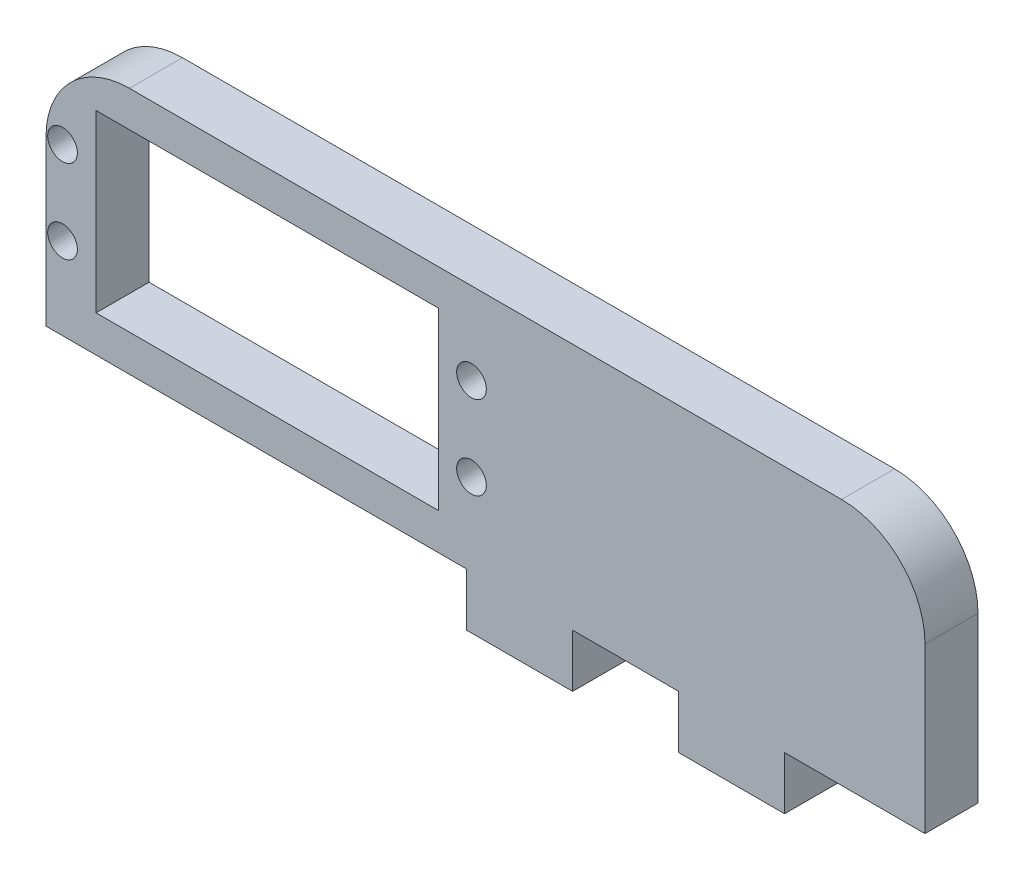
ISO-10303-21;
HEADER;
FILE_DESCRIPTION(('STEP AP214'),'2;1');
FILE_NAME('part.step','',(''),(''),'','','');
FILE_SCHEMA(('AUTOMOTIVE_DESIGN { 1 0 10303 214 1 1 1 1 }'));
ENDSEC;
DATA;
#1=APPLICATION_CONTEXT('core data for automotive mechanical design processes');
#2=APPLICATION_PROTOCOL_DEFINITION('international standard','automotive_design',2000,#1);
#3=PRODUCT_CONTEXT('',#1,'mechanical');
#4=PRODUCT('Part','Part','',(#3));
#5=PRODUCT_RELATED_PRODUCT_CATEGORY('part','',(#4));
#6=PRODUCT_DEFINITION_FORMATION('','',#4);
#7=PRODUCT_DEFINITION_CONTEXT('part definition',#1,'design');
#8=PRODUCT_DEFINITION('design','',#6,#7);
#9=PRODUCT_DEFINITION_SHAPE('','',#8);
#10=(LENGTH_UNIT() NAMED_UNIT(*) SI_UNIT(.MILLI.,.METRE.));
#11=(NAMED_UNIT(*) PLANE_ANGLE_UNIT() SI_UNIT($,.RADIAN.));
#12=(NAMED_UNIT(*) SI_UNIT($,.STERADIAN.) SOLID_ANGLE_UNIT());
#13=UNCERTAINTY_MEASURE_WITH_UNIT(LENGTH_MEASURE(1.E-05),#10,'distance_accuracy_value','');
#14=(GEOMETRIC_REPRESENTATION_CONTEXT(3) GLOBAL_UNCERTAINTY_ASSIGNED_CONTEXT((#13)) GLOBAL_UNIT_ASSIGNED_CONTEXT((#10,
#11,#12)) REPRESENTATION_CONTEXT('',''));
#15=CARTESIAN_POINT('',(0.,0.,0.));
#16=DIRECTION('',(0.,0.,1.));
#17=DIRECTION('',(1.,0.,0.));
#18=AXIS2_PLACEMENT_3D('',#15,#16,#17);
#19=CARTESIAN_POINT('',(19.05,38.1,6.35));
#20=DIRECTION('',(0.,1.,0.));
#21=DIRECTION('',(0.,0.,1.));
#22=AXIS2_PLACEMENT_3D('',#19,#20,#21);
#23=PLANE('',#22);
#24=DIRECTION('',(1.,0.,0.));
#25=VECTOR('',#24,1.);
#26=CARTESIAN_POINT('',(19.05,38.1,0.));
#27=LINE('',#26,#25);
#28=CARTESIAN_POINT('',(6.35,38.1,0.));
#29=VERTEX_POINT('',#28);
#30=CARTESIAN_POINT('',(19.05,38.1,0.));
#31=VERTEX_POINT('',#30);
#32=EDGE_CURVE('E204',#29,#31,#27,.T.);
#33=ORIENTED_EDGE('',*,*,#32,.T.);
#34=DIRECTION('',(0.,0.,-1.));
#35=VECTOR('',#34,1.);
#36=CARTESIAN_POINT('',(19.05,38.1,6.35));
#37=LINE('',#36,#35);
#38=CARTESIAN_POINT('',(19.05,38.1,6.35));
#39=VERTEX_POINT('',#38);
#40=EDGE_CURVE('E284',#39,#31,#37,.T.);
#41=ORIENTED_EDGE('',*,*,#40,.F.);
#42=DIRECTION('',(1.,0.,0.));
#43=VECTOR('',#42,1.);
#44=CARTESIAN_POINT('',(19.05,38.1,6.35));
#45=LINE('',#44,#43);
#46=CARTESIAN_POINT('',(6.35,38.1,6.35));
#47=VERTEX_POINT('',#46);
#48=EDGE_CURVE('E208',#47,#39,#45,.T.);
#49=ORIENTED_EDGE('',*,*,#48,.F.);
#50=DIRECTION('',(0.,0.,-1.));
#51=VECTOR('',#50,1.);
#52=CARTESIAN_POINT('',(6.35,38.1,6.35));
#53=LINE('',#52,#51);
#54=EDGE_CURVE('E234',#47,#29,#53,.T.);
#55=ORIENTED_EDGE('',*,*,#54,.T.);
#56=EDGE_LOOP('',(#33,#41,#49,#55));
#57=FACE_BOUND('',#56,.T.);
#58=ADVANCED_FACE('F33',(#57),#23,.F.);
#59=CARTESIAN_POINT('',(19.05,38.1,6.35));
#60=DIRECTION('',(-1.,0.,0.));
#61=DIRECTION('',(0.,0.,1.));
#62=AXIS2_PLACEMENT_3D('',#59,#60,#61);
#63=PLANE('',#62);
#64=DIRECTION('',(0.,1.,0.));
#65=VECTOR('',#64,1.);
#66=CARTESIAN_POINT('',(19.05,38.1,0.));
#67=LINE('',#66,#65);
#68=CARTESIAN_POINT('',(19.05,44.45,0.));
#69=VERTEX_POINT('',#68);
#70=EDGE_CURVE('E237',#31,#69,#67,.T.);
#71=ORIENTED_EDGE('',*,*,#70,.T.);
#72=DIRECTION('',(0.,0.,-1.));
#73=VECTOR('',#72,1.);
#74=CARTESIAN_POINT('',(19.05,44.45,6.35));
#75=LINE('',#74,#73);
#76=CARTESIAN_POINT('',(19.05,44.45,6.35));
#77=VERTEX_POINT('',#76);
#78=EDGE_CURVE('E281',#77,#69,#75,.T.);
#79=ORIENTED_EDGE('',*,*,#78,.F.);
#80=DIRECTION('',(0.,1.,0.));
#81=VECTOR('',#80,1.);
#82=CARTESIAN_POINT('',(19.05,38.1,6.35));
#83=LINE('',#82,#81);
#84=EDGE_CURVE('E211',#39,#77,#83,.T.);
#85=ORIENTED_EDGE('',*,*,#84,.F.);
#86=ORIENTED_EDGE('',*,*,#40,.T.);
#87=EDGE_LOOP('',(#71,#79,#85,#86));
#88=FACE_BOUND('',#87,.T.);
#89=ADVANCED_FACE('F329',(#88),#63,.F.);
#90=CARTESIAN_POINT('',(19.05,44.45,6.35));
#91=DIRECTION('',(0.,1.,0.));
#92=DIRECTION('',(0.,0.,1.));
#93=AXIS2_PLACEMENT_3D('',#90,#91,#92);
#94=PLANE('',#93);
#95=DIRECTION('',(1.,0.,0.));
#96=VECTOR('',#95,1.);
#97=CARTESIAN_POINT('',(19.05,44.45,0.));
#98=LINE('',#97,#96);
#99=CARTESIAN_POINT('',(35.8723967170345,44.45,0.));
#100=VERTEX_POINT('',#99);
#101=EDGE_CURVE('E239',#69,#100,#98,.T.);
#102=ORIENTED_EDGE('',*,*,#101,.T.);
#103=DIRECTION('',(0.,0.,-1.));
#104=VECTOR('',#103,1.);
#105=CARTESIAN_POINT('',(35.8723967170345,44.45,6.35));
#106=LINE('',#105,#104);
#107=CARTESIAN_POINT('',(35.8723967170345,44.45,6.35));
#108=VERTEX_POINT('',#107);
#109=EDGE_CURVE('E278',#108,#100,#106,.T.);
#110=ORIENTED_EDGE('',*,*,#109,.F.);
#111=DIRECTION('',(1.,0.,0.));
#112=VECTOR('',#111,1.);
#113=CARTESIAN_POINT('',(19.05,44.45,6.35));
#114=LINE('',#113,#112);
#115=EDGE_CURVE('E214',#77,#108,#114,.T.);
#116=ORIENTED_EDGE('',*,*,#115,.F.);
#117=ORIENTED_EDGE('',*,*,#78,.T.);
#118=EDGE_LOOP('',(#102,#110,#116,#117));
#119=FACE_BOUND('',#118,.T.);
#120=ADVANCED_FACE('F323',(#119),#94,.F.);
#121=CARTESIAN_POINT('',(35.8723967170345,44.45,6.35));
#122=DIRECTION('',(-1.,0.,0.));
#123=DIRECTION('',(0.,0.,1.));
#124=AXIS2_PLACEMENT_3D('',#121,#122,#123);
#125=PLANE('',#124);
#126=DIRECTION('',(0.,1.,0.));
#127=VECTOR('',#126,1.);
#128=CARTESIAN_POINT('',(35.8723967170345,44.45,0.));
#129=LINE('',#128,#127);
#130=CARTESIAN_POINT('',(35.8723967170345,64.1298835764106,0.));
#131=VERTEX_POINT('',#130);
#132=EDGE_CURVE('E241',#100,#131,#129,.T.);
#133=ORIENTED_EDGE('',*,*,#132,.T.);
#134=DIRECTION('',(0.,0.,-1.));
#135=VECTOR('',#134,1.);
#136=CARTESIAN_POINT('',(35.8723967170345,64.1298835764106,6.35));
#137=LINE('',#136,#135);
#138=CARTESIAN_POINT('',(35.8723967170345,64.1298835764106,6.35));
#139=VERTEX_POINT('',#138);
#140=EDGE_CURVE('E11',#131,#139,#137,.F.);
#141=ORIENTED_EDGE('',*,*,#140,.T.);
#142=DIRECTION('',(0.,1.,0.));
#143=VECTOR('',#142,1.);
#144=CARTESIAN_POINT('',(35.8723967170345,44.45,6.35));
#145=LINE('',#144,#143);
#146=EDGE_CURVE('E216',#108,#139,#145,.T.);
#147=ORIENTED_EDGE('',*,*,#146,.F.);
#148=ORIENTED_EDGE('',*,*,#109,.T.);
#149=EDGE_LOOP('',(#133,#141,#147,#148));
#150=FACE_BOUND('',#149,.T.);
#151=ADVANCED_FACE('F319',(#150),#125,.F.);
#152=CARTESIAN_POINT('',(-69.45,74.1298835764105,6.35));
#153=DIRECTION('',(0.,-1.,0.));
#154=DIRECTION('',(0.,0.,-1.));
#155=AXIS2_PLACEMENT_3D('',#152,#153,#154);
#156=PLANE('',#155);
#157=DIRECTION('',(-1.,0.,0.));
#158=VECTOR('',#157,1.);
#159=CARTESIAN_POINT('',(-69.45,74.1298835764105,0.));
#160=LINE('',#159,#158);
#161=CARTESIAN_POINT('',(25.8723967170345,74.1298835764105,0.));
#162=VERTEX_POINT('',#161);
#163=CARTESIAN_POINT('',(-59.45,74.1298835764105,0.));
#164=VERTEX_POINT('',#163);
#165=EDGE_CURVE('E243',#162,#164,#160,.T.);
#166=ORIENTED_EDGE('',*,*,#165,.T.);
#167=DIRECTION('',(0.,0.,-1.));
#168=VECTOR('',#167,1.);
#169=CARTESIAN_POINT('',(-59.45,74.1298835764105,6.35));
#170=LINE('',#169,#168);
#171=CARTESIAN_POINT('',(-59.45,74.1298835764105,6.35));
#172=VERTEX_POINT('',#171);
#173=EDGE_CURVE('E54',#164,#172,#170,.F.);
#174=ORIENTED_EDGE('',*,*,#173,.T.);
#175=DIRECTION('',(-1.,0.,0.));
#176=VECTOR('',#175,1.);
#177=CARTESIAN_POINT('',(35.8723967170345,74.1298835764105,6.35));
#178=LINE('',#177,#176);
#179=CARTESIAN_POINT('',(25.8723967170345,74.1298835764105,6.35));
#180=VERTEX_POINT('',#179);
#181=EDGE_CURVE('E218',#180,#172,#178,.T.);
#182=ORIENTED_EDGE('',*,*,#181,.F.);
#183=DIRECTION('',(0.,0.,-1.));
#184=VECTOR('',#183,1.);
#185=CARTESIAN_POINT('',(25.8723967170345,74.1298835764105,6.35));
#186=LINE('',#185,#184);
#187=EDGE_CURVE('E294',#180,#162,#186,.T.);
#188=ORIENTED_EDGE('',*,*,#187,.T.);
#189=EDGE_LOOP('',(#166,#174,#182,#188));
#190=FACE_BOUND('',#189,.T.);
#191=ADVANCED_FACE('F313',(#190),#156,.F.);
#192=CARTESIAN_POINT('',(-69.45,44.45,6.35));
#193=DIRECTION('',(1.,0.,0.));
#194=DIRECTION('',(0.,0.,-1.));
#195=AXIS2_PLACEMENT_3D('',#192,#193,#194);
#196=PLANE('',#195);
#197=DIRECTION('',(0.,-1.,0.));
#198=VECTOR('',#197,1.);
#199=CARTESIAN_POINT('',(-69.45,44.45,6.35));
#200=LINE('',#199,#198);
#201=CARTESIAN_POINT('',(-69.45,64.1298835764106,6.35));
#202=VERTEX_POINT('',#201);
#203=CARTESIAN_POINT('',(-69.45,44.45,6.35));
#204=VERTEX_POINT('',#203);
#205=EDGE_CURVE('E220',#202,#204,#200,.T.);
#206=ORIENTED_EDGE('',*,*,#205,.F.);
#207=DIRECTION('',(0.,0.,-1.));
#208=VECTOR('',#207,1.);
#209=CARTESIAN_POINT('',(-69.45,64.1298835764106,6.35));
#210=LINE('',#209,#208);
#211=CARTESIAN_POINT('',(-69.45,64.1298835764106,0.));
#212=VERTEX_POINT('',#211);
#213=EDGE_CURVE('E287',#202,#212,#210,.T.);
#214=ORIENTED_EDGE('',*,*,#213,.T.);
#215=DIRECTION('',(0.,-1.,0.));
#216=VECTOR('',#215,1.);
#217=CARTESIAN_POINT('',(-69.45,44.45,0.));
#218=LINE('',#217,#216);
#219=CARTESIAN_POINT('',(-69.45,44.45,0.));
#220=VERTEX_POINT('',#219);
#221=EDGE_CURVE('E245',#212,#220,#218,.T.);
#222=ORIENTED_EDGE('',*,*,#221,.T.);
#223=DIRECTION('',(0.,0.,-1.));
#224=VECTOR('',#223,1.);
#225=CARTESIAN_POINT('',(-69.45,44.45,6.35));
#226=LINE('',#225,#224);
#227=EDGE_CURVE('E275',#204,#220,#226,.T.);
#228=ORIENTED_EDGE('',*,*,#227,.F.);
#229=EDGE_LOOP('',(#206,#214,#222,#228));
#230=FACE_BOUND('',#229,.T.);
#231=ADVANCED_FACE('F307',(#230),#196,.F.);
#232=CARTESIAN_POINT('',(-19.05,44.45,6.35));
#233=DIRECTION('',(0.,1.,0.));
#234=DIRECTION('',(0.,0.,1.));
#235=AXIS2_PLACEMENT_3D('',#232,#233,#234);
#236=PLANE('',#235);
#237=DIRECTION('',(1.,0.,0.));
#238=VECTOR('',#237,1.);
#239=CARTESIAN_POINT('',(-19.05,44.45,0.));
#240=LINE('',#239,#238);
#241=CARTESIAN_POINT('',(-19.05,44.45,0.));
#242=VERTEX_POINT('',#241);
#243=EDGE_CURVE('E247',#220,#242,#240,.T.);
#244=ORIENTED_EDGE('',*,*,#243,.T.);
#245=DIRECTION('',(0.,0.,-1.));
#246=VECTOR('',#245,1.);
#247=CARTESIAN_POINT('',(-19.05,44.45,6.35));
#248=LINE('',#247,#246);
#249=CARTESIAN_POINT('',(-19.05,44.45,6.35));
#250=VERTEX_POINT('',#249);
#251=EDGE_CURVE('E272',#250,#242,#248,.T.);
#252=ORIENTED_EDGE('',*,*,#251,.F.);
#253=DIRECTION('',(1.,0.,0.));
#254=VECTOR('',#253,1.);
#255=CARTESIAN_POINT('',(-44.45,44.45,6.35));
#256=LINE('',#255,#254);
#257=EDGE_CURVE('E222',#204,#250,#256,.T.);
#258=ORIENTED_EDGE('',*,*,#257,.F.);
#259=ORIENTED_EDGE('',*,*,#227,.T.);
#260=EDGE_LOOP('',(#244,#252,#258,#259));
#261=FACE_BOUND('',#260,.T.);
#262=ADVANCED_FACE('F358',(#261),#236,.F.);
#263=CARTESIAN_POINT('',(-19.05,38.1,6.35));
#264=DIRECTION('',(1.,0.,0.));
#265=DIRECTION('',(0.,0.,-1.));
#266=AXIS2_PLACEMENT_3D('',#263,#264,#265);
#267=PLANE('',#266);
#268=DIRECTION('',(0.,-1.,0.));
#269=VECTOR('',#268,1.);
#270=CARTESIAN_POINT('',(-19.05,38.1,0.));
#271=LINE('',#270,#269);
#272=CARTESIAN_POINT('',(-19.05,38.1,0.));
#273=VERTEX_POINT('',#272);
#274=EDGE_CURVE('E249',#242,#273,#271,.T.);
#275=ORIENTED_EDGE('',*,*,#274,.T.);
#276=DIRECTION('',(0.,0.,-1.));
#277=VECTOR('',#276,1.);
#278=CARTESIAN_POINT('',(-19.05,38.1,6.35));
#279=LINE('',#278,#277);
#280=CARTESIAN_POINT('',(-19.05,38.1,6.35));
#281=VERTEX_POINT('',#280);
#282=EDGE_CURVE('E269',#281,#273,#279,.T.);
#283=ORIENTED_EDGE('',*,*,#282,.F.);
#284=DIRECTION('',(0.,-1.,0.));
#285=VECTOR('',#284,1.);
#286=CARTESIAN_POINT('',(-19.05,38.1,6.35));
#287=LINE('',#286,#285);
#288=EDGE_CURVE('E224',#250,#281,#287,.T.);
#289=ORIENTED_EDGE('',*,*,#288,.F.);
#290=ORIENTED_EDGE('',*,*,#251,.T.);
#291=EDGE_LOOP('',(#275,#283,#289,#290));
#292=FACE_BOUND('',#291,.T.);
#293=ADVANCED_FACE('F354',(#292),#267,.F.);
#294=CARTESIAN_POINT('',(-6.35,38.1,6.35));
#295=DIRECTION('',(0.,1.,0.));
#296=DIRECTION('',(0.,0.,1.));
#297=AXIS2_PLACEMENT_3D('',#294,#295,#296);
#298=PLANE('',#297);
#299=DIRECTION('',(1.,0.,0.));
#300=VECTOR('',#299,1.);
#301=CARTESIAN_POINT('',(-6.35,38.1,0.));
#302=LINE('',#301,#300);
#303=CARTESIAN_POINT('',(-6.35,38.1,0.));
#304=VERTEX_POINT('',#303);
#305=EDGE_CURVE('E251',#273,#304,#302,.T.);
#306=ORIENTED_EDGE('',*,*,#305,.T.);
#307=DIRECTION('',(0.,0.,-1.));
#308=VECTOR('',#307,1.);
#309=CARTESIAN_POINT('',(-6.35,38.1,6.35));
#310=LINE('',#309,#308);
#311=CARTESIAN_POINT('',(-6.35,38.1,6.35));
#312=VERTEX_POINT('',#311);
#313=EDGE_CURVE('E266',#312,#304,#310,.T.);
#314=ORIENTED_EDGE('',*,*,#313,.F.);
#315=DIRECTION('',(1.,0.,0.));
#316=VECTOR('',#315,1.);
#317=CARTESIAN_POINT('',(-6.35,38.1,6.35));
#318=LINE('',#317,#316);
#319=EDGE_CURVE('E226',#281,#312,#318,.T.);
#320=ORIENTED_EDGE('',*,*,#319,.F.);
#321=ORIENTED_EDGE('',*,*,#282,.T.);
#322=EDGE_LOOP('',(#306,#314,#320,#321));
#323=FACE_BOUND('',#322,.T.);
#324=ADVANCED_FACE('F350',(#323),#298,.F.);
#325=CARTESIAN_POINT('',(-6.35,44.45,6.35));
#326=DIRECTION('',(-1.,0.,0.));
#327=DIRECTION('',(0.,0.,1.));
#328=AXIS2_PLACEMENT_3D('',#325,#326,#327);
#329=PLANE('',#328);
#330=DIRECTION('',(0.,1.,0.));
#331=VECTOR('',#330,1.);
#332=CARTESIAN_POINT('',(-6.35,44.45,0.));
#333=LINE('',#332,#331);
#334=CARTESIAN_POINT('',(-6.35,44.45,0.));
#335=VERTEX_POINT('',#334);
#336=EDGE_CURVE('E253',#304,#335,#333,.T.);
#337=ORIENTED_EDGE('',*,*,#336,.T.);
#338=DIRECTION('',(0.,0.,-1.));
#339=VECTOR('',#338,1.);
#340=CARTESIAN_POINT('',(-6.35,44.45,6.35));
#341=LINE('',#340,#339);
#342=CARTESIAN_POINT('',(-6.35,44.45,6.35));
#343=VERTEX_POINT('',#342);
#344=EDGE_CURVE('E263',#343,#335,#341,.T.);
#345=ORIENTED_EDGE('',*,*,#344,.F.);
#346=DIRECTION('',(0.,1.,0.));
#347=VECTOR('',#346,1.);
#348=CARTESIAN_POINT('',(-6.35,44.45,6.35));
#349=LINE('',#348,#347);
#350=EDGE_CURVE('E228',#312,#343,#349,.T.);
#351=ORIENTED_EDGE('',*,*,#350,.F.);
#352=ORIENTED_EDGE('',*,*,#313,.T.);
#353=EDGE_LOOP('',(#337,#345,#351,#352));
#354=FACE_BOUND('',#353,.T.);
#355=ADVANCED_FACE('F346',(#354),#329,.F.);
#356=CARTESIAN_POINT('',(6.35,44.45,6.35));
#357=DIRECTION('',(0.,1.,0.));
#358=DIRECTION('',(0.,0.,1.));
#359=AXIS2_PLACEMENT_3D('',#356,#357,#358);
#360=PLANE('',#359);
#361=DIRECTION('',(1.,0.,0.));
#362=VECTOR('',#361,1.);
#363=CARTESIAN_POINT('',(6.35,44.45,0.));
#364=LINE('',#363,#362);
#365=CARTESIAN_POINT('',(6.35,44.45,0.));
#366=VERTEX_POINT('',#365);
#367=EDGE_CURVE('E255',#335,#366,#364,.T.);
#368=ORIENTED_EDGE('',*,*,#367,.T.);
#369=DIRECTION('',(0.,0.,-1.));
#370=VECTOR('',#369,1.);
#371=CARTESIAN_POINT('',(6.35,44.45,6.35));
#372=LINE('',#371,#370);
#373=CARTESIAN_POINT('',(6.35,44.45,6.35));
#374=VERTEX_POINT('',#373);
#375=EDGE_CURVE('E260',#374,#366,#372,.T.);
#376=ORIENTED_EDGE('',*,*,#375,.F.);
#377=DIRECTION('',(1.,0.,0.));
#378=VECTOR('',#377,1.);
#379=CARTESIAN_POINT('',(6.35,44.45,6.35));
#380=LINE('',#379,#378);
#381=EDGE_CURVE('E230',#343,#374,#380,.T.);
#382=ORIENTED_EDGE('',*,*,#381,.F.);
#383=ORIENTED_EDGE('',*,*,#344,.T.);
#384=EDGE_LOOP('',(#368,#376,#382,#383));
#385=FACE_BOUND('',#384,.T.);
#386=ADVANCED_FACE('F341',(#385),#360,.F.);
#387=CARTESIAN_POINT('',(6.35,38.1,6.35));
#388=DIRECTION('',(1.,0.,0.));
#389=DIRECTION('',(0.,0.,-1.));
#390=AXIS2_PLACEMENT_3D('',#387,#388,#389);
#391=PLANE('',#390);
#392=DIRECTION('',(0.,-1.,0.));
#393=VECTOR('',#392,1.);
#394=CARTESIAN_POINT('',(6.35,38.1,0.));
#395=LINE('',#394,#393);
#396=EDGE_CURVE('E212',#366,#29,#395,.T.);
#397=ORIENTED_EDGE('',*,*,#396,.T.);
#398=ORIENTED_EDGE('',*,*,#54,.F.);
#399=DIRECTION('',(0.,-1.,0.));
#400=VECTOR('',#399,1.);
#401=CARTESIAN_POINT('',(6.35,38.1,6.35));
#402=LINE('',#401,#400);
#403=EDGE_CURVE('E232',#374,#47,#402,.T.);
#404=ORIENTED_EDGE('',*,*,#403,.F.);
#405=ORIENTED_EDGE('',*,*,#375,.T.);
#406=EDGE_LOOP('',(#397,#398,#404,#405));
#407=FACE_BOUND('',#406,.T.);
#408=ADVANCED_FACE('F335',(#407),#391,.F.);
#409=CARTESIAN_POINT('',(0.,0.,6.35));
#410=DIRECTION('',(0.,0.,-1.));
#411=DIRECTION('',(-1.,0.,0.));
#412=AXIS2_PLACEMENT_3D('',#409,#410,#411);
#413=PLANE('',#412);
#414=CARTESIAN_POINT('',(-18.4705,64.2899417882053,6.35));
#415=DIRECTION('',(0.,0.,1.));
#416=DIRECTION('',(1.,0.,0.));
#417=AXIS2_PLACEMENT_3D('',#414,#415,#416);
#418=CIRCLE('',#417,1.77800000000001);
#419=CARTESIAN_POINT('',(-16.6925,64.2899417882053,6.35));
#420=VERTEX_POINT('',#419);
#421=EDGE_CURVE('E594',#420,#420,#418,.T.);
#422=ORIENTED_EDGE('',*,*,#421,.F.);
#423=EDGE_LOOP('',(#422));
#424=FACE_BOUND('',#423,.T.);
#425=CARTESIAN_POINT('',(-18.4705,54.2899417882053,6.35));
#426=DIRECTION('',(0.,0.,1.));
#427=DIRECTION('',(1.,0.,0.));
#428=AXIS2_PLACEMENT_3D('',#425,#426,#427);
#429=CIRCLE('',#428,1.77800000000001);
#430=CARTESIAN_POINT('',(-16.6925,54.2899417882053,6.35));
#431=VERTEX_POINT('',#430);
#432=EDGE_CURVE('E590',#431,#431,#429,.T.);
#433=ORIENTED_EDGE('',*,*,#432,.F.);
#434=EDGE_LOOP('',(#433));
#435=FACE_BOUND('',#434,.T.);
#436=CARTESIAN_POINT('',(-67.4705,54.2899417882053,6.35));
#437=DIRECTION('',(0.,0.,1.));
#438=DIRECTION('',(1.,0.,0.));
#439=AXIS2_PLACEMENT_3D('',#436,#437,#438);
#440=CIRCLE('',#439,1.77800000000001);
#441=CARTESIAN_POINT('',(-65.6925,54.2899417882053,6.35));
#442=VERTEX_POINT('',#441);
#443=EDGE_CURVE('E586',#442,#442,#440,.T.);
#444=ORIENTED_EDGE('',*,*,#443,.F.);
#445=EDGE_LOOP('',(#444));
#446=FACE_BOUND('',#445,.T.);
#447=CARTESIAN_POINT('',(-67.4705,64.2899417882053,6.35));
#448=DIRECTION('',(0.,0.,1.));
#449=DIRECTION('',(1.,0.,0.));
#450=AXIS2_PLACEMENT_3D('',#447,#448,#449);
#451=CIRCLE('',#450,1.778);
#452=CARTESIAN_POINT('',(-65.6925,64.2899417882053,6.35));
#453=VERTEX_POINT('',#452);
#454=EDGE_CURVE('E191',#453,#453,#451,.T.);
#455=ORIENTED_EDGE('',*,*,#454,.F.);
#456=EDGE_LOOP('',(#455));
#457=FACE_BOUND('',#456,.T.);
#458=DIRECTION('',(1.,0.,0.));
#459=VECTOR('',#458,1.);
#460=CARTESIAN_POINT('',(-63.45,48.8298835764106,6.35));
#461=LINE('',#460,#459);
#462=CARTESIAN_POINT('',(-63.45,48.8298835764106,6.35));
#463=VERTEX_POINT('',#462);
#464=CARTESIAN_POINT('',(-22.45,48.8298835764106,6.35));
#465=VERTEX_POINT('',#464);
#466=EDGE_CURVE('E197',#463,#465,#461,.T.);
#467=ORIENTED_EDGE('',*,*,#466,.F.);
#468=DIRECTION('',(0.,-1.,0.));
#469=VECTOR('',#468,1.);
#470=CARTESIAN_POINT('',(-63.45,69.8298835764106,6.35));
#471=LINE('',#470,#469);
#472=CARTESIAN_POINT('',(-63.45,69.8298835764106,6.35));
#473=VERTEX_POINT('',#472);
#474=EDGE_CURVE('E167',#473,#463,#471,.T.);
#475=ORIENTED_EDGE('',*,*,#474,.F.);
#476=DIRECTION('',(-1.,0.,0.));
#477=VECTOR('',#476,1.);
#478=CARTESIAN_POINT('',(-63.45,69.8298835764106,6.35));
#479=LINE('',#478,#477);
#480=CARTESIAN_POINT('',(-22.45,69.8298835764106,6.35));
#481=VERTEX_POINT('',#480);
#482=EDGE_CURVE('E185',#481,#473,#479,.T.);
#483=ORIENTED_EDGE('',*,*,#482,.F.);
#484=DIRECTION('',(0.,1.,0.));
#485=VECTOR('',#484,1.);
#486=CARTESIAN_POINT('',(-22.45,69.8298835764106,6.35));
#487=LINE('',#486,#485);
#488=EDGE_CURVE('E188',#465,#481,#487,.T.);
#489=ORIENTED_EDGE('',*,*,#488,.F.);
#490=EDGE_LOOP('',(#467,#475,#483,#489));
#491=FACE_BOUND('',#490,.T.);
#492=ORIENTED_EDGE('',*,*,#181,.T.);
#493=CARTESIAN_POINT('',(-59.45,64.1298835764106,6.35));
#494=DIRECTION('',(0.,0.,-1.));
#495=DIRECTION('',(-1.,0.,0.));
#496=AXIS2_PLACEMENT_3D('',#493,#494,#495);
#497=CIRCLE('',#496,10.);
#498=EDGE_CURVE('E41',#172,#202,#497,.F.);
#499=ORIENTED_EDGE('',*,*,#498,.T.);
#500=ORIENTED_EDGE('',*,*,#205,.T.);
#501=ORIENTED_EDGE('',*,*,#257,.T.);
#502=ORIENTED_EDGE('',*,*,#288,.T.);
#503=ORIENTED_EDGE('',*,*,#319,.T.);
#504=ORIENTED_EDGE('',*,*,#350,.T.);
#505=ORIENTED_EDGE('',*,*,#381,.T.);
#506=ORIENTED_EDGE('',*,*,#403,.T.);
#507=ORIENTED_EDGE('',*,*,#48,.T.);
#508=ORIENTED_EDGE('',*,*,#84,.T.);
#509=ORIENTED_EDGE('',*,*,#115,.T.);
#510=ORIENTED_EDGE('',*,*,#146,.T.);
#511=CARTESIAN_POINT('',(25.8723967170345,64.1298835764106,6.35));
#512=DIRECTION('',(0.,0.,-1.));
#513=DIRECTION('',(-1.,0.,0.));
#514=AXIS2_PLACEMENT_3D('',#511,#512,#513);
#515=CIRCLE('',#514,10.);
#516=EDGE_CURVE('E298',#139,#180,#515,.F.);
#517=ORIENTED_EDGE('',*,*,#516,.T.);
#518=EDGE_LOOP('',(#492,#499,#500,#501,#502,#503,#504,#505,#506,#507,#508,#509,#510,#517));
#519=FACE_BOUND('',#518,.T.);
#520=ADVANCED_FACE('F302',(#424,#435,#446,#457,#491,#519),#413,.F.);
#521=CARTESIAN_POINT('',(0.,0.,0.));
#522=DIRECTION('',(0.,0.,-1.));
#523=DIRECTION('',(-1.,0.,0.));
#524=AXIS2_PLACEMENT_3D('',#521,#522,#523);
#525=PLANE('',#524);
#526=CARTESIAN_POINT('',(-18.4705,64.2899417882053,0.));
#527=DIRECTION('',(0.,0.,1.));
#528=DIRECTION('',(1.,0.,0.));
#529=AXIS2_PLACEMENT_3D('',#526,#527,#528);
#530=CIRCLE('',#529,1.77800000000001);
#531=CARTESIAN_POINT('',(-16.6925,64.2899417882053,0.));
#532=VERTEX_POINT('',#531);
#533=EDGE_CURVE('E573',#532,#532,#530,.T.);
#534=ORIENTED_EDGE('',*,*,#533,.T.);
#535=EDGE_LOOP('',(#534));
#536=FACE_BOUND('',#535,.T.);
#537=CARTESIAN_POINT('',(-18.4705,54.2899417882053,0.));
#538=DIRECTION('',(0.,0.,1.));
#539=DIRECTION('',(1.,0.,0.));
#540=AXIS2_PLACEMENT_3D('',#537,#538,#539);
#541=CIRCLE('',#540,1.77800000000001);
#542=CARTESIAN_POINT('',(-16.6925,54.2899417882053,0.));
#543=VERTEX_POINT('',#542);
#544=EDGE_CURVE('E577',#543,#543,#541,.T.);
#545=ORIENTED_EDGE('',*,*,#544,.T.);
#546=EDGE_LOOP('',(#545));
#547=FACE_BOUND('',#546,.T.);
#548=CARTESIAN_POINT('',(-67.4705,54.2899417882053,0.));
#549=DIRECTION('',(0.,0.,1.));
#550=DIRECTION('',(1.,0.,0.));
#551=AXIS2_PLACEMENT_3D('',#548,#549,#550);
#552=CIRCLE('',#551,1.77800000000001);
#553=CARTESIAN_POINT('',(-65.6925,54.2899417882053,0.));
#554=VERTEX_POINT('',#553);
#555=EDGE_CURVE('E581',#554,#554,#552,.T.);
#556=ORIENTED_EDGE('',*,*,#555,.T.);
#557=EDGE_LOOP('',(#556));
#558=FACE_BOUND('',#557,.T.);
#559=CARTESIAN_POINT('',(-67.4705,64.2899417882053,0.));
#560=DIRECTION('',(0.,0.,1.));
#561=DIRECTION('',(1.,0.,0.));
#562=AXIS2_PLACEMENT_3D('',#559,#560,#561);
#563=CIRCLE('',#562,1.778);
#564=CARTESIAN_POINT('',(-65.6925,64.2899417882053,0.));
#565=VERTEX_POINT('',#564);
#566=EDGE_CURVE('E198',#565,#565,#563,.T.);
#567=ORIENTED_EDGE('',*,*,#566,.T.);
#568=EDGE_LOOP('',(#567));
#569=FACE_BOUND('',#568,.T.);
#570=DIRECTION('',(0.,-1.,0.));
#571=VECTOR('',#570,1.);
#572=CARTESIAN_POINT('',(-63.45,69.8298835764106,0.));
#573=LINE('',#572,#571);
#574=CARTESIAN_POINT('',(-63.45,69.8298835764106,0.));
#575=VERTEX_POINT('',#574);
#576=CARTESIAN_POINT('',(-63.45,48.8298835764106,0.));
#577=VERTEX_POINT('',#576);
#578=EDGE_CURVE('E164',#575,#577,#573,.T.);
#579=ORIENTED_EDGE('',*,*,#578,.T.);
#580=DIRECTION('',(1.,0.,0.));
#581=VECTOR('',#580,1.);
#582=CARTESIAN_POINT('',(-63.45,48.8298835764106,0.));
#583=LINE('',#582,#581);
#584=CARTESIAN_POINT('',(-22.45,48.8298835764106,0.));
#585=VERTEX_POINT('',#584);
#586=EDGE_CURVE('E176',#577,#585,#583,.T.);
#587=ORIENTED_EDGE('',*,*,#586,.T.);
#588=DIRECTION('',(0.,1.,0.));
#589=VECTOR('',#588,1.);
#590=CARTESIAN_POINT('',(-22.45,69.8298835764106,0.));
#591=LINE('',#590,#589);
#592=CARTESIAN_POINT('',(-22.45,69.8298835764106,0.));
#593=VERTEX_POINT('',#592);
#594=EDGE_CURVE('E180',#585,#593,#591,.T.);
#595=ORIENTED_EDGE('',*,*,#594,.T.);
#596=DIRECTION('',(-1.,0.,0.));
#597=VECTOR('',#596,1.);
#598=CARTESIAN_POINT('',(-63.45,69.8298835764106,0.));
#599=LINE('',#598,#597);
#600=EDGE_CURVE('E172',#593,#575,#599,.T.);
#601=ORIENTED_EDGE('',*,*,#600,.T.);
#602=EDGE_LOOP('',(#579,#587,#595,#601));
#603=FACE_BOUND('',#602,.T.);
#604=ORIENTED_EDGE('',*,*,#221,.F.);
#605=CARTESIAN_POINT('',(-59.45,64.1298835764106,0.));
#606=DIRECTION('',(0.,0.,-1.));
#607=DIRECTION('',(-1.,0.,0.));
#608=AXIS2_PLACEMENT_3D('',#605,#606,#607);
#609=CIRCLE('',#608,10.);
#610=EDGE_CURVE('E292',#212,#164,#609,.T.);
#611=ORIENTED_EDGE('',*,*,#610,.T.);
#612=ORIENTED_EDGE('',*,*,#165,.F.);
#613=CARTESIAN_POINT('',(25.8723967170345,64.1298835764106,0.));
#614=DIRECTION('',(0.,0.,-1.));
#615=DIRECTION('',(-1.,0.,0.));
#616=AXIS2_PLACEMENT_3D('',#613,#614,#615);
#617=CIRCLE('',#616,10.);
#618=EDGE_CURVE('E290',#162,#131,#617,.T.);
#619=ORIENTED_EDGE('',*,*,#618,.T.);
#620=ORIENTED_EDGE('',*,*,#132,.F.);
#621=ORIENTED_EDGE('',*,*,#101,.F.);
#622=ORIENTED_EDGE('',*,*,#70,.F.);
#623=ORIENTED_EDGE('',*,*,#32,.F.);
#624=ORIENTED_EDGE('',*,*,#396,.F.);
#625=ORIENTED_EDGE('',*,*,#367,.F.);
#626=ORIENTED_EDGE('',*,*,#336,.F.);
#627=ORIENTED_EDGE('',*,*,#305,.F.);
#628=ORIENTED_EDGE('',*,*,#274,.F.);
#629=ORIENTED_EDGE('',*,*,#243,.F.);
#630=EDGE_LOOP('',(#604,#611,#612,#619,#620,#621,#622,#623,#624,#625,#626,#627,#628,#629));
#631=FACE_BOUND('',#630,.T.);
#632=ADVANCED_FACE('F182',(#536,#547,#558,#569,#603,#631),#525,.T.);
#633=CARTESIAN_POINT('',(-63.45,69.8298835764106,0.));
#634=DIRECTION('',(-1.,0.,0.));
#635=DIRECTION('',(0.,0.,1.));
#636=AXIS2_PLACEMENT_3D('',#633,#634,#635);
#637=PLANE('',#636);
#638=ORIENTED_EDGE('',*,*,#474,.T.);
#639=DIRECTION('',(0.,0.,1.));
#640=VECTOR('',#639,1.);
#641=CARTESIAN_POINT('',(-63.45,48.8298835764106,0.));
#642=LINE('',#641,#640);
#643=EDGE_CURVE('E160',#577,#463,#642,.T.);
#644=ORIENTED_EDGE('',*,*,#643,.F.);
#645=ORIENTED_EDGE('',*,*,#578,.F.);
#646=DIRECTION('',(0.,0.,1.));
#647=VECTOR('',#646,1.);
#648=CARTESIAN_POINT('',(-63.45,69.8298835764106,0.));
#649=LINE('',#648,#647);
#650=EDGE_CURVE('E202',#575,#473,#649,.T.);
#651=ORIENTED_EDGE('',*,*,#650,.T.);
#652=EDGE_LOOP('',(#638,#644,#645,#651));
#653=FACE_BOUND('',#652,.T.);
#654=ADVANCED_FACE('F162',(#653),#637,.F.);
#655=CARTESIAN_POINT('',(-63.45,69.8298835764106,0.));
#656=DIRECTION('',(0.,1.,0.));
#657=DIRECTION('',(0.,0.,1.));
#658=AXIS2_PLACEMENT_3D('',#655,#656,#657);
#659=PLANE('',#658);
#660=ORIENTED_EDGE('',*,*,#482,.T.);
#661=ORIENTED_EDGE('',*,*,#650,.F.);
#662=ORIENTED_EDGE('',*,*,#600,.F.);
#663=DIRECTION('',(0.,0.,1.));
#664=VECTOR('',#663,1.);
#665=CARTESIAN_POINT('',(-22.45,69.8298835764106,0.));
#666=LINE('',#665,#664);
#667=EDGE_CURVE('E205',#593,#481,#666,.T.);
#668=ORIENTED_EDGE('',*,*,#667,.T.);
#669=EDGE_LOOP('',(#660,#661,#662,#668));
#670=FACE_BOUND('',#669,.T.);
#671=ADVANCED_FACE('F399',(#670),#659,.F.);
#672=CARTESIAN_POINT('',(-22.45,69.8298835764106,0.));
#673=DIRECTION('',(1.,0.,0.));
#674=DIRECTION('',(0.,1.,0.));
#675=AXIS2_PLACEMENT_3D('',#672,#673,#674);
#676=PLANE('',#675);
#677=ORIENTED_EDGE('',*,*,#488,.T.);
#678=ORIENTED_EDGE('',*,*,#667,.F.);
#679=ORIENTED_EDGE('',*,*,#594,.F.);
#680=DIRECTION('',(0.,0.,1.));
#681=VECTOR('',#680,1.);
#682=CARTESIAN_POINT('',(-22.45,48.8298835764106,0.));
#683=LINE('',#682,#681);
#684=EDGE_CURVE('E171',#585,#465,#683,.T.);
#685=ORIENTED_EDGE('',*,*,#684,.T.);
#686=EDGE_LOOP('',(#677,#678,#679,#685));
#687=FACE_BOUND('',#686,.T.);
#688=ADVANCED_FACE('F402',(#687),#676,.F.);
#689=CARTESIAN_POINT('',(-63.45,48.8298835764106,0.));
#690=DIRECTION('',(0.,-1.,0.));
#691=DIRECTION('',(0.,0.,-1.));
#692=AXIS2_PLACEMENT_3D('',#689,#690,#691);
#693=PLANE('',#692);
#694=ORIENTED_EDGE('',*,*,#466,.T.);
#695=ORIENTED_EDGE('',*,*,#684,.F.);
#696=ORIENTED_EDGE('',*,*,#586,.F.);
#697=ORIENTED_EDGE('',*,*,#643,.T.);
#698=EDGE_LOOP('',(#694,#695,#696,#697));
#699=FACE_BOUND('',#698,.T.);
#700=ADVANCED_FACE('F177',(#699),#693,.F.);
#701=CARTESIAN_POINT('',(-67.4705,64.2899417882053,0.));
#702=DIRECTION('',(0.,0.,1.));
#703=DIRECTION('',(1.,0.,0.));
#704=AXIS2_PLACEMENT_3D('',#701,#702,#703);
#705=CYLINDRICAL_SURFACE('',#704,1.778);
#706=ORIENTED_EDGE('',*,*,#566,.F.);
#707=EDGE_LOOP('',(#706));
#708=FACE_BOUND('',#707,.T.);
#709=ORIENTED_EDGE('',*,*,#454,.T.);
#710=EDGE_LOOP('',(#709));
#711=FACE_BOUND('',#710,.T.);
#712=ADVANCED_FACE('F394',(#708,#711),#705,.F.);
#713=CARTESIAN_POINT('',(-67.4705,54.2899417882053,0.));
#714=DIRECTION('',(0.,0.,1.));
#715=DIRECTION('',(1.,0.,0.));
#716=AXIS2_PLACEMENT_3D('',#713,#714,#715);
#717=CYLINDRICAL_SURFACE('',#716,1.77800000000001);
#718=ORIENTED_EDGE('',*,*,#555,.F.);
#719=EDGE_LOOP('',(#718));
#720=FACE_BOUND('',#719,.T.);
#721=ORIENTED_EDGE('',*,*,#443,.T.);
#722=EDGE_LOOP('',(#721));
#723=FACE_BOUND('',#722,.T.);
#724=ADVANCED_FACE('F386',(#720,#723),#717,.F.);
#725=CARTESIAN_POINT('',(-18.4705,54.2899417882053,0.));
#726=DIRECTION('',(0.,0.,1.));
#727=DIRECTION('',(1.,0.,0.));
#728=AXIS2_PLACEMENT_3D('',#725,#726,#727);
#729=CYLINDRICAL_SURFACE('',#728,1.77800000000001);
#730=ORIENTED_EDGE('',*,*,#544,.F.);
#731=EDGE_LOOP('',(#730));
#732=FACE_BOUND('',#731,.T.);
#733=ORIENTED_EDGE('',*,*,#432,.T.);
#734=EDGE_LOOP('',(#733));
#735=FACE_BOUND('',#734,.T.);
#736=ADVANCED_FACE('F380',(#732,#735),#729,.F.);
#737=CARTESIAN_POINT('',(-18.4705,64.2899417882053,0.));
#738=DIRECTION('',(0.,0.,1.));
#739=DIRECTION('',(1.,0.,0.));
#740=AXIS2_PLACEMENT_3D('',#737,#738,#739);
#741=CYLINDRICAL_SURFACE('',#740,1.77800000000001);
#742=ORIENTED_EDGE('',*,*,#533,.F.);
#743=EDGE_LOOP('',(#742));
#744=FACE_BOUND('',#743,.T.);
#745=ORIENTED_EDGE('',*,*,#421,.T.);
#746=EDGE_LOOP('',(#745));
#747=FACE_BOUND('',#746,.T.);
#748=ADVANCED_FACE('F375',(#744,#747),#741,.F.);
#749=CARTESIAN_POINT('',(-59.45,64.1298835764106,6.35));
#750=DIRECTION('',(0.,0.,-1.));
#751=DIRECTION('',(-1.,0.,0.));
#752=AXIS2_PLACEMENT_3D('',#749,#750,#751);
#753=CYLINDRICAL_SURFACE('',#752,10.);
#754=ORIENTED_EDGE('',*,*,#498,.F.);
#755=ORIENTED_EDGE('',*,*,#173,.F.);
#756=ORIENTED_EDGE('',*,*,#610,.F.);
#757=ORIENTED_EDGE('',*,*,#213,.F.);
#758=EDGE_LOOP('',(#754,#755,#756,#757));
#759=FACE_BOUND('',#758,.T.);
#760=ADVANCED_FACE('F310',(#759),#753,.T.);
#761=CARTESIAN_POINT('',(25.8723967170345,64.1298835764106,6.35));
#762=DIRECTION('',(0.,0.,-1.));
#763=DIRECTION('',(-1.,0.,0.));
#764=AXIS2_PLACEMENT_3D('',#761,#762,#763);
#765=CYLINDRICAL_SURFACE('',#764,10.);
#766=ORIENTED_EDGE('',*,*,#516,.F.);
#767=ORIENTED_EDGE('',*,*,#140,.F.);
#768=ORIENTED_EDGE('',*,*,#618,.F.);
#769=ORIENTED_EDGE('',*,*,#187,.F.);
#770=EDGE_LOOP('',(#766,#767,#768,#769));
#771=FACE_BOUND('',#770,.T.);
#772=ADVANCED_FACE('F35',(#771),#765,.T.);
#773=CLOSED_SHELL('',(#58,#89,#120,#151,#191,#231,#262,#293,#324,#355,#386,#408,#520,#632,#654,
#671,#688,#700,#712,#724,#736,#748,#760,#772));
#774=MANIFOLD_SOLID_BREP('B2',#773);
#775=ADVANCED_BREP_SHAPE_REPRESENTATION('',(#18,#774),#14);
#776=SHAPE_DEFINITION_REPRESENTATION(#9,#775);
ENDSEC;
END-ISO-10303-21;
